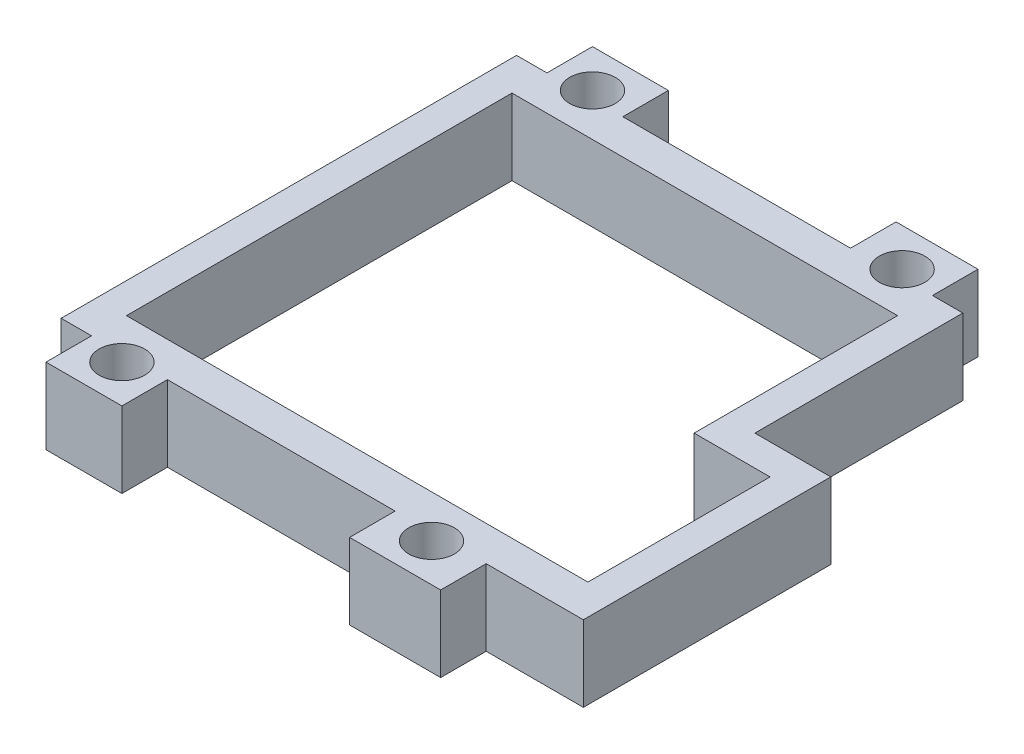
ISO-10303-21;
HEADER;
FILE_DESCRIPTION(('STEP AP214'),'2;1');
FILE_NAME('part.step','',(''),(''),'','','');
FILE_SCHEMA(('AUTOMOTIVE_DESIGN { 1 0 10303 214 1 1 1 1 }'));
ENDSEC;
DATA;
#1=APPLICATION_CONTEXT('core data for automotive mechanical design processes');
#2=APPLICATION_PROTOCOL_DEFINITION('international standard','automotive_design',2000,#1);
#3=PRODUCT_CONTEXT('',#1,'mechanical');
#4=PRODUCT('Part','Part','',(#3));
#5=PRODUCT_RELATED_PRODUCT_CATEGORY('part','',(#4));
#6=PRODUCT_DEFINITION_FORMATION('','',#4);
#7=PRODUCT_DEFINITION_CONTEXT('part definition',#1,'design');
#8=PRODUCT_DEFINITION('design','',#6,#7);
#9=PRODUCT_DEFINITION_SHAPE('','',#8);
#10=(LENGTH_UNIT() NAMED_UNIT(*) SI_UNIT(.MILLI.,.METRE.));
#11=(NAMED_UNIT(*) PLANE_ANGLE_UNIT() SI_UNIT($,.RADIAN.));
#12=(NAMED_UNIT(*) SI_UNIT($,.STERADIAN.) SOLID_ANGLE_UNIT());
#13=UNCERTAINTY_MEASURE_WITH_UNIT(LENGTH_MEASURE(1.E-05),#10,'distance_accuracy_value','');
#14=(GEOMETRIC_REPRESENTATION_CONTEXT(3) GLOBAL_UNCERTAINTY_ASSIGNED_CONTEXT((#13)) GLOBAL_UNIT_ASSIGNED_CONTEXT((#10,
#11,#12)) REPRESENTATION_CONTEXT('',''));
#15=CARTESIAN_POINT('',(0.,0.,0.));
#16=DIRECTION('',(0.,0.,1.));
#17=DIRECTION('',(1.,0.,0.));
#18=AXIS2_PLACEMENT_3D('',#15,#16,#17);
#19=CARTESIAN_POINT('',(-17.2,5.,-18.));
#20=DIRECTION('',(0.,0.,1.));
#21=DIRECTION('',(1.,0.,0.));
#22=AXIS2_PLACEMENT_3D('',#19,#20,#21);
#23=PLANE('',#22);
#24=DIRECTION('',(-1.,0.,0.));
#25=VECTOR('',#24,1.);
#26=CARTESIAN_POINT('',(-17.2,5.,-18.));
#27=LINE('',#26,#25);
#28=CARTESIAN_POINT('',(-10.2,5.,-18.));
#29=VERTEX_POINT('',#28);
#30=CARTESIAN_POINT('',(-15.2,5.,-18.));
#31=VERTEX_POINT('',#30);
#32=EDGE_CURVE('E260',#29,#31,#27,.T.);
#33=ORIENTED_EDGE('',*,*,#32,.F.);
#34=DIRECTION('',(0.,1.,0.));
#35=VECTOR('',#34,1.);
#36=CARTESIAN_POINT('',(-10.2,0.,-18.));
#37=LINE('',#36,#35);
#38=CARTESIAN_POINT('',(-10.2,0.,-18.));
#39=VERTEX_POINT('',#38);
#40=EDGE_CURVE('E412',#39,#29,#37,.T.);
#41=ORIENTED_EDGE('',*,*,#40,.F.);
#42=DIRECTION('',(-1.,0.,0.));
#43=VECTOR('',#42,1.);
#44=CARTESIAN_POINT('',(-17.2,0.,-18.));
#45=LINE('',#44,#43);
#46=CARTESIAN_POINT('',(-15.2,0.,-18.));
#47=VERTEX_POINT('',#46);
#48=EDGE_CURVE('E249',#39,#47,#45,.T.);
#49=ORIENTED_EDGE('',*,*,#48,.T.);
#50=DIRECTION('',(0.,1.,0.));
#51=VECTOR('',#50,1.);
#52=CARTESIAN_POINT('',(-15.2,0.,-18.));
#53=LINE('',#52,#51);
#54=EDGE_CURVE('E393',#47,#31,#53,.T.);
#55=ORIENTED_EDGE('',*,*,#54,.T.);
#56=EDGE_LOOP('',(#33,#41,#49,#55));
#57=FACE_BOUND('',#56,.T.);
#58=ADVANCED_FACE('F37',(#57),#23,.F.);
#59=CARTESIAN_POINT('',(-17.2,5.,18.));
#60=DIRECTION('',(0.,0.,-1.));
#61=DIRECTION('',(-1.,0.,0.));
#62=AXIS2_PLACEMENT_3D('',#59,#60,#61);
#63=PLANE('',#62);
#64=DIRECTION('',(1.,0.,0.));
#65=VECTOR('',#64,1.);
#66=CARTESIAN_POINT('',(-17.2,5.,18.));
#67=LINE('',#66,#65);
#68=CARTESIAN_POINT('',(-15.2,5.,18.));
#69=VERTEX_POINT('',#68);
#70=CARTESIAN_POINT('',(-10.2,5.,18.));
#71=VERTEX_POINT('',#70);
#72=EDGE_CURVE('E11',#69,#71,#67,.T.);
#73=ORIENTED_EDGE('',*,*,#72,.F.);
#74=DIRECTION('',(0.,1.,0.));
#75=VECTOR('',#74,1.);
#76=CARTESIAN_POINT('',(-15.2,0.,18.));
#77=LINE('',#76,#75);
#78=CARTESIAN_POINT('',(-15.2,0.,18.));
#79=VERTEX_POINT('',#78);
#80=EDGE_CURVE('E379',#79,#69,#77,.T.);
#81=ORIENTED_EDGE('',*,*,#80,.F.);
#82=DIRECTION('',(1.,0.,0.));
#83=VECTOR('',#82,1.);
#84=CARTESIAN_POINT('',(-17.2,0.,18.));
#85=LINE('',#84,#83);
#86=CARTESIAN_POINT('',(-10.2,0.,18.));
#87=VERTEX_POINT('',#86);
#88=EDGE_CURVE('E41',#79,#87,#85,.T.);
#89=ORIENTED_EDGE('',*,*,#88,.T.);
#90=DIRECTION('',(0.,1.,0.));
#91=VECTOR('',#90,1.);
#92=CARTESIAN_POINT('',(-10.2,0.,18.));
#93=LINE('',#92,#91);
#94=EDGE_CURVE('E334',#87,#71,#93,.T.);
#95=ORIENTED_EDGE('',*,*,#94,.T.);
#96=EDGE_LOOP('',(#73,#81,#89,#95));
#97=FACE_BOUND('',#96,.T.);
#98=ADVANCED_FACE('F496',(#97),#63,.F.);
#99=CARTESIAN_POINT('',(17.2,5.,18.));
#100=DIRECTION('',(-1.,0.,0.));
#101=DIRECTION('',(0.,0.,1.));
#102=AXIS2_PLACEMENT_3D('',#99,#100,#101);
#103=PLANE('',#102);
#104=DIRECTION('',(0.,0.,-1.));
#105=VECTOR('',#104,1.);
#106=CARTESIAN_POINT('',(17.2,0.,18.));
#107=LINE('',#106,#105);
#108=CARTESIAN_POINT('',(17.2,0.,15.));
#109=VERTEX_POINT('',#108);
#110=CARTESIAN_POINT('',(17.2,0.,-1.3));
#111=VERTEX_POINT('',#110);
#112=EDGE_CURVE('E252',#109,#111,#107,.T.);
#113=ORIENTED_EDGE('',*,*,#112,.T.);
#114=DIRECTION('',(0.,1.,0.));
#115=VECTOR('',#114,1.);
#116=CARTESIAN_POINT('',(17.2,0.,-1.3));
#117=LINE('',#116,#115);
#118=CARTESIAN_POINT('',(17.2,5.,-1.3));
#119=VERTEX_POINT('',#118);
#120=EDGE_CURVE('E434',#111,#119,#117,.T.);
#121=ORIENTED_EDGE('',*,*,#120,.T.);
#122=DIRECTION('',(0.,0.,-1.));
#123=VECTOR('',#122,1.);
#124=CARTESIAN_POINT('',(17.2,5.,18.));
#125=LINE('',#124,#123);
#126=CARTESIAN_POINT('',(17.2,5.,15.));
#127=VERTEX_POINT('',#126);
#128=EDGE_CURVE('E261',#127,#119,#125,.T.);
#129=ORIENTED_EDGE('',*,*,#128,.F.);
#130=DIRECTION('',(0.,1.,0.));
#131=VECTOR('',#130,1.);
#132=CARTESIAN_POINT('',(17.2,0.,15.));
#133=LINE('',#132,#131);
#134=EDGE_CURVE('E361',#109,#127,#133,.T.);
#135=ORIENTED_EDGE('',*,*,#134,.F.);
#136=EDGE_LOOP('',(#113,#121,#129,#135));
#137=FACE_BOUND('',#136,.T.);
#138=ADVANCED_FACE('F39',(#137),#103,.F.);
#139=CARTESIAN_POINT('',(10.2,5.,-18.));
#140=VERTEX_POINT('',#139);
#141=CARTESIAN_POINT('',(4.8,5.,-18.));
#142=VERTEX_POINT('',#141);
#143=EDGE_CURVE('E241',#140,#142,#27,.T.);
#144=ORIENTED_EDGE('',*,*,#143,.F.);
#145=DIRECTION('',(0.,1.,0.));
#146=VECTOR('',#145,1.);
#147=CARTESIAN_POINT('',(10.2,0.,-18.));
#148=LINE('',#147,#146);
#149=CARTESIAN_POINT('',(10.2,0.,-18.));
#150=VERTEX_POINT('',#149);
#151=EDGE_CURVE('E228',#150,#140,#148,.T.);
#152=ORIENTED_EDGE('',*,*,#151,.F.);
#153=CARTESIAN_POINT('',(4.8,0.,-18.));
#154=VERTEX_POINT('',#153);
#155=EDGE_CURVE('E239',#150,#154,#45,.T.);
#156=ORIENTED_EDGE('',*,*,#155,.T.);
#157=DIRECTION('',(0.,1.,0.));
#158=VECTOR('',#157,1.);
#159=CARTESIAN_POINT('',(4.8,0.,-18.));
#160=LINE('',#159,#158);
#161=EDGE_CURVE('E421',#154,#142,#160,.T.);
#162=ORIENTED_EDGE('',*,*,#161,.T.);
#163=EDGE_LOOP('',(#144,#152,#156,#162));
#164=FACE_BOUND('',#163,.T.);
#165=ADVANCED_FACE('F237',(#164),#23,.F.);
#166=CARTESIAN_POINT('',(-17.2,5.,18.));
#167=DIRECTION('',(1.,0.,0.));
#168=DIRECTION('',(0.,0.,-1.));
#169=AXIS2_PLACEMENT_3D('',#166,#167,#168);
#170=PLANE('',#169);
#171=DIRECTION('',(0.,0.,1.));
#172=VECTOR('',#171,1.);
#173=CARTESIAN_POINT('',(-17.2,5.,18.));
#174=LINE('',#173,#172);
#175=CARTESIAN_POINT('',(-17.2,5.,-15.));
#176=VERTEX_POINT('',#175);
#177=CARTESIAN_POINT('',(-17.2,5.,15.));
#178=VERTEX_POINT('',#177);
#179=EDGE_CURVE('E257',#176,#178,#174,.T.);
#180=ORIENTED_EDGE('',*,*,#179,.F.);
#181=DIRECTION('',(0.,1.,0.));
#182=VECTOR('',#181,1.);
#183=CARTESIAN_POINT('',(-17.2,0.,-15.));
#184=LINE('',#183,#182);
#185=CARTESIAN_POINT('',(-17.2,0.,-15.));
#186=VERTEX_POINT('',#185);
#187=EDGE_CURVE('E398',#186,#176,#184,.T.);
#188=ORIENTED_EDGE('',*,*,#187,.F.);
#189=DIRECTION('',(0.,0.,1.));
#190=VECTOR('',#189,1.);
#191=CARTESIAN_POINT('',(-17.2,0.,18.));
#192=LINE('',#191,#190);
#193=CARTESIAN_POINT('',(-17.2,0.,15.));
#194=VERTEX_POINT('',#193);
#195=EDGE_CURVE('E248',#186,#194,#192,.T.);
#196=ORIENTED_EDGE('',*,*,#195,.T.);
#197=DIRECTION('',(0.,1.,0.));
#198=VECTOR('',#197,1.);
#199=CARTESIAN_POINT('',(-17.2,0.,15.));
#200=LINE('',#199,#198);
#201=EDGE_CURVE('E374',#194,#178,#200,.T.);
#202=ORIENTED_EDGE('',*,*,#201,.T.);
#203=EDGE_LOOP('',(#180,#188,#196,#202));
#204=FACE_BOUND('',#203,.T.);
#205=ADVANCED_FACE('F513',(#204),#170,.F.);
#206=CARTESIAN_POINT('',(4.8,0.,18.));
#207=VERTEX_POINT('',#206);
#208=CARTESIAN_POINT('',(10.8,0.,18.));
#209=VERTEX_POINT('',#208);
#210=EDGE_CURVE('E251',#207,#209,#85,.T.);
#211=ORIENTED_EDGE('',*,*,#210,.T.);
#212=DIRECTION('',(0.,1.,0.));
#213=VECTOR('',#212,1.);
#214=CARTESIAN_POINT('',(10.8,0.,18.));
#215=LINE('',#214,#213);
#216=CARTESIAN_POINT('',(10.8,5.,18.));
#217=VERTEX_POINT('',#216);
#218=EDGE_CURVE('E353',#209,#217,#215,.T.);
#219=ORIENTED_EDGE('',*,*,#218,.T.);
#220=CARTESIAN_POINT('',(4.8,5.,18.));
#221=VERTEX_POINT('',#220);
#222=EDGE_CURVE('E46',#221,#217,#67,.T.);
#223=ORIENTED_EDGE('',*,*,#222,.F.);
#224=DIRECTION('',(0.,1.,0.));
#225=VECTOR('',#224,1.);
#226=CARTESIAN_POINT('',(4.8,0.,18.));
#227=LINE('',#226,#225);
#228=EDGE_CURVE('E337',#207,#221,#227,.T.);
#229=ORIENTED_EDGE('',*,*,#228,.F.);
#230=EDGE_LOOP('',(#211,#219,#223,#229));
#231=FACE_BOUND('',#230,.T.);
#232=ADVANCED_FACE('F483',(#231),#63,.F.);
#233=CARTESIAN_POINT('',(0.,5.,0.));
#234=DIRECTION('',(0.,-1.,0.));
#235=DIRECTION('',(0.,0.,-1.));
#236=AXIS2_PLACEMENT_3D('',#233,#234,#235);
#237=PLANE('',#236);
#238=CARTESIAN_POINT('',(-12.7,5.,15.5));
#239=DIRECTION('',(0.,1.,0.));
#240=DIRECTION('',(0.,0.,1.));
#241=AXIS2_PLACEMENT_3D('',#238,#239,#240);
#242=CIRCLE('',#241,1.5);
#243=CARTESIAN_POINT('',(-12.7,5.,17.));
#244=VERTEX_POINT('',#243);
#245=EDGE_CURVE('E309',#244,#244,#242,.T.);
#246=ORIENTED_EDGE('',*,*,#245,.F.);
#247=EDGE_LOOP('',(#246));
#248=FACE_BOUND('',#247,.T.);
#249=CARTESIAN_POINT('',(7.7,5.,15.5));
#250=DIRECTION('',(0.,1.,0.));
#251=DIRECTION('',(0.,0.,1.));
#252=AXIS2_PLACEMENT_3D('',#249,#250,#251);
#253=CIRCLE('',#252,1.5);
#254=CARTESIAN_POINT('',(7.7,5.,17.));
#255=VERTEX_POINT('',#254);
#256=EDGE_CURVE('E303',#255,#255,#253,.T.);
#257=ORIENTED_EDGE('',*,*,#256,.F.);
#258=EDGE_LOOP('',(#257));
#259=FACE_BOUND('',#258,.T.);
#260=CARTESIAN_POINT('',(7.7,5.,-15.5));
#261=DIRECTION('',(0.,1.,0.));
#262=DIRECTION('',(0.,0.,1.));
#263=AXIS2_PLACEMENT_3D('',#260,#261,#262);
#264=CIRCLE('',#263,1.5);
#265=CARTESIAN_POINT('',(7.7,5.,-14.));
#266=VERTEX_POINT('',#265);
#267=EDGE_CURVE('E297',#266,#266,#264,.T.);
#268=ORIENTED_EDGE('',*,*,#267,.F.);
#269=EDGE_LOOP('',(#268));
#270=FACE_BOUND('',#269,.T.);
#271=DIRECTION('',(0.,0.,-1.));
#272=VECTOR('',#271,1.);
#273=CARTESIAN_POINT('',(10.2,5.,-12.7));
#274=LINE('',#273,#272);
#275=CARTESIAN_POINT('',(10.2,5.,0.700000000000003));
#276=VERTEX_POINT('',#275);
#277=CARTESIAN_POINT('',(10.2,5.,-12.7));
#278=VERTEX_POINT('',#277);
#279=EDGE_CURVE('E282',#276,#278,#274,.T.);
#280=ORIENTED_EDGE('',*,*,#279,.F.);
#281=DIRECTION('',(-1.,0.,0.));
#282=VECTOR('',#281,1.);
#283=CARTESIAN_POINT('',(10.2,5.,0.700000000000003));
#284=LINE('',#283,#282);
#285=CARTESIAN_POINT('',(15.2,5.,0.700000000000003));
#286=VERTEX_POINT('',#285);
#287=EDGE_CURVE('E323',#286,#276,#284,.T.);
#288=ORIENTED_EDGE('',*,*,#287,.F.);
#289=DIRECTION('',(0.,0.,-1.));
#290=VECTOR('',#289,1.);
#291=CARTESIAN_POINT('',(15.2,5.,12.7));
#292=LINE('',#291,#290);
#293=CARTESIAN_POINT('',(15.2,5.,12.7));
#294=VERTEX_POINT('',#293);
#295=EDGE_CURVE('E326',#294,#286,#292,.T.);
#296=ORIENTED_EDGE('',*,*,#295,.F.);
#297=DIRECTION('',(1.,0.,0.));
#298=VECTOR('',#297,1.);
#299=CARTESIAN_POINT('',(-15.2,5.,12.7));
#300=LINE('',#299,#298);
#301=CARTESIAN_POINT('',(-15.2,5.,12.7));
#302=VERTEX_POINT('',#301);
#303=EDGE_CURVE('E284',#302,#294,#300,.T.);
#304=ORIENTED_EDGE('',*,*,#303,.F.);
#305=DIRECTION('',(0.,0.,1.));
#306=VECTOR('',#305,1.);
#307=CARTESIAN_POINT('',(-15.2,5.,-12.7));
#308=LINE('',#307,#306);
#309=CARTESIAN_POINT('',(-15.2,5.,-12.7));
#310=VERTEX_POINT('',#309);
#311=EDGE_CURVE('E286',#310,#302,#308,.T.);
#312=ORIENTED_EDGE('',*,*,#311,.F.);
#313=DIRECTION('',(-1.,0.,0.));
#314=VECTOR('',#313,1.);
#315=CARTESIAN_POINT('',(-15.2,5.,-12.7));
#316=LINE('',#315,#314);
#317=EDGE_CURVE('E278',#278,#310,#316,.T.);
#318=ORIENTED_EDGE('',*,*,#317,.F.);
#319=EDGE_LOOP('',(#280,#288,#296,#304,#312,#318));
#320=FACE_BOUND('',#319,.T.);
#321=CARTESIAN_POINT('',(-12.7,5.,-15.5));
#322=DIRECTION('',(0.,1.,0.));
#323=DIRECTION('',(0.,0.,1.));
#324=AXIS2_PLACEMENT_3D('',#321,#322,#323);
#325=CIRCLE('',#324,1.5);
#326=CARTESIAN_POINT('',(-12.7,5.,-14.));
#327=VERTEX_POINT('',#326);
#328=EDGE_CURVE('E264',#327,#327,#325,.T.);
#329=ORIENTED_EDGE('',*,*,#328,.F.);
#330=EDGE_LOOP('',(#329));
#331=FACE_BOUND('',#330,.T.);
#332=DIRECTION('',(0.,0.,1.));
#333=VECTOR('',#332,1.);
#334=CARTESIAN_POINT('',(12.2,5.,-18.));
#335=LINE('',#334,#333);
#336=CARTESIAN_POINT('',(12.2,5.,-15.));
#337=VERTEX_POINT('',#336);
#338=CARTESIAN_POINT('',(12.2,5.,-1.3));
#339=VERTEX_POINT('',#338);
#340=EDGE_CURVE('E448',#337,#339,#335,.T.);
#341=ORIENTED_EDGE('',*,*,#340,.F.);
#342=DIRECTION('',(1.,0.,0.));
#343=VECTOR('',#342,1.);
#344=CARTESIAN_POINT('',(12.2,5.,-15.));
#345=LINE('',#344,#343);
#346=CARTESIAN_POINT('',(10.2,5.,-15.));
#347=VERTEX_POINT('',#346);
#348=EDGE_CURVE('E54',#347,#337,#345,.T.);
#349=ORIENTED_EDGE('',*,*,#348,.F.);
#350=DIRECTION('',(0.,0.,1.));
#351=VECTOR('',#350,1.);
#352=CARTESIAN_POINT('',(10.2,5.,-18.));
#353=LINE('',#352,#351);
#354=EDGE_CURVE('E456',#140,#347,#353,.T.);
#355=ORIENTED_EDGE('',*,*,#354,.F.);
#356=ORIENTED_EDGE('',*,*,#143,.T.);
#357=DIRECTION('',(0.,0.,-1.));
#358=VECTOR('',#357,1.);
#359=CARTESIAN_POINT('',(4.8,5.,-18.));
#360=LINE('',#359,#358);
#361=CARTESIAN_POINT('',(4.8,5.,-15.));
#362=VERTEX_POINT('',#361);
#363=EDGE_CURVE('E424',#362,#142,#360,.T.);
#364=ORIENTED_EDGE('',*,*,#363,.F.);
#365=DIRECTION('',(1.,0.,0.));
#366=VECTOR('',#365,1.);
#367=CARTESIAN_POINT('',(-10.2,5.,-15.));
#368=LINE('',#367,#366);
#369=CARTESIAN_POINT('',(-10.2,5.,-15.));
#370=VERTEX_POINT('',#369);
#371=EDGE_CURVE('E428',#370,#362,#368,.T.);
#372=ORIENTED_EDGE('',*,*,#371,.F.);
#373=DIRECTION('',(0.,0.,1.));
#374=VECTOR('',#373,1.);
#375=CARTESIAN_POINT('',(-10.2,5.,-18.));
#376=LINE('',#375,#374);
#377=EDGE_CURVE('E431',#29,#370,#376,.T.);
#378=ORIENTED_EDGE('',*,*,#377,.F.);
#379=ORIENTED_EDGE('',*,*,#32,.T.);
#380=DIRECTION('',(0.,0.,-1.));
#381=VECTOR('',#380,1.);
#382=CARTESIAN_POINT('',(-15.2,5.,-18.));
#383=LINE('',#382,#381);
#384=CARTESIAN_POINT('',(-15.2,5.,-15.));
#385=VERTEX_POINT('',#384);
#386=EDGE_CURVE('E405',#385,#31,#383,.T.);
#387=ORIENTED_EDGE('',*,*,#386,.F.);
#388=DIRECTION('',(1.,0.,0.));
#389=VECTOR('',#388,1.);
#390=CARTESIAN_POINT('',(-17.2,5.,-15.));
#391=LINE('',#390,#389);
#392=EDGE_CURVE('E409',#176,#385,#391,.T.);
#393=ORIENTED_EDGE('',*,*,#392,.F.);
#394=ORIENTED_EDGE('',*,*,#179,.T.);
#395=DIRECTION('',(-1.,0.,0.));
#396=VECTOR('',#395,1.);
#397=CARTESIAN_POINT('',(-17.2,5.,15.));
#398=LINE('',#397,#396);
#399=CARTESIAN_POINT('',(-15.2,5.,15.));
#400=VERTEX_POINT('',#399);
#401=EDGE_CURVE('E386',#400,#178,#398,.T.);
#402=ORIENTED_EDGE('',*,*,#401,.F.);
#403=DIRECTION('',(0.,0.,-1.));
#404=VECTOR('',#403,1.);
#405=CARTESIAN_POINT('',(-15.2,5.,18.));
#406=LINE('',#405,#404);
#407=EDGE_CURVE('E390',#69,#400,#406,.T.);
#408=ORIENTED_EDGE('',*,*,#407,.F.);
#409=ORIENTED_EDGE('',*,*,#72,.T.);
#410=DIRECTION('',(0.,0.,1.));
#411=VECTOR('',#410,1.);
#412=CARTESIAN_POINT('',(-10.2,5.,18.));
#413=LINE('',#412,#411);
#414=CARTESIAN_POINT('',(-10.2,5.,15.));
#415=VERTEX_POINT('',#414);
#416=EDGE_CURVE('E350',#415,#71,#413,.T.);
#417=ORIENTED_EDGE('',*,*,#416,.F.);
#418=DIRECTION('',(-1.,0.,0.));
#419=VECTOR('',#418,1.);
#420=CARTESIAN_POINT('',(-10.2,5.,15.));
#421=LINE('',#420,#419);
#422=CARTESIAN_POINT('',(4.8,5.,15.));
#423=VERTEX_POINT('',#422);
#424=EDGE_CURVE('E343',#423,#415,#421,.T.);
#425=ORIENTED_EDGE('',*,*,#424,.F.);
#426=DIRECTION('',(0.,0.,-1.));
#427=VECTOR('',#426,1.);
#428=CARTESIAN_POINT('',(4.8,5.,18.));
#429=LINE('',#428,#427);
#430=EDGE_CURVE('E347',#221,#423,#429,.T.);
#431=ORIENTED_EDGE('',*,*,#430,.F.);
#432=ORIENTED_EDGE('',*,*,#222,.T.);
#433=DIRECTION('',(0.,0.,1.));
#434=VECTOR('',#433,1.);
#435=CARTESIAN_POINT('',(10.8,5.,18.));
#436=LINE('',#435,#434);
#437=CARTESIAN_POINT('',(10.8,5.,15.));
#438=VERTEX_POINT('',#437);
#439=EDGE_CURVE('E368',#438,#217,#436,.T.);
#440=ORIENTED_EDGE('',*,*,#439,.F.);
#441=DIRECTION('',(-1.,0.,0.));
#442=VECTOR('',#441,1.);
#443=CARTESIAN_POINT('',(17.2,5.,15.));
#444=LINE('',#443,#442);
#445=EDGE_CURVE('E371',#127,#438,#444,.T.);
#446=ORIENTED_EDGE('',*,*,#445,.F.);
#447=ORIENTED_EDGE('',*,*,#128,.T.);
#448=DIRECTION('',(1.,0.,0.));
#449=VECTOR('',#448,1.);
#450=CARTESIAN_POINT('',(17.2,5.,-1.3));
#451=LINE('',#450,#449);
#452=EDGE_CURVE('E446',#339,#119,#451,.T.);
#453=ORIENTED_EDGE('',*,*,#452,.F.);
#454=EDGE_LOOP('',(#341,#349,#355,#356,#364,#372,#378,#379,#387,#393,#394,#402,#408,#409,#417,
#425,#431,#432,#440,#446,#447,#453));
#455=FACE_BOUND('',#454,.T.);
#456=ADVANCED_FACE('F466',(#248,#259,#270,#320,#331,#455),#237,.F.);
#457=CARTESIAN_POINT('',(0.,0.,0.));
#458=DIRECTION('',(0.,-1.,0.));
#459=DIRECTION('',(0.,0.,-1.));
#460=AXIS2_PLACEMENT_3D('',#457,#458,#459);
#461=PLANE('',#460);
#462=DIRECTION('',(1.,0.,0.));
#463=VECTOR('',#462,1.);
#464=CARTESIAN_POINT('',(12.2,0.,-15.));
#465=LINE('',#464,#463);
#466=CARTESIAN_POINT('',(10.2,0.,-15.));
#467=VERTEX_POINT('',#466);
#468=CARTESIAN_POINT('',(12.2,0.,-15.));
#469=VERTEX_POINT('',#468);
#470=EDGE_CURVE('E233',#467,#469,#465,.T.);
#471=ORIENTED_EDGE('',*,*,#470,.T.);
#472=DIRECTION('',(0.,0.,1.));
#473=VECTOR('',#472,1.);
#474=CARTESIAN_POINT('',(12.2,0.,-18.));
#475=LINE('',#474,#473);
#476=CARTESIAN_POINT('',(12.2,0.,-1.3));
#477=VERTEX_POINT('',#476);
#478=EDGE_CURVE('E62',#469,#477,#475,.T.);
#479=ORIENTED_EDGE('',*,*,#478,.T.);
#480=DIRECTION('',(1.,0.,0.));
#481=VECTOR('',#480,1.);
#482=CARTESIAN_POINT('',(17.2,0.,-1.3));
#483=LINE('',#482,#481);
#484=EDGE_CURVE('E443',#477,#111,#483,.T.);
#485=ORIENTED_EDGE('',*,*,#484,.T.);
#486=ORIENTED_EDGE('',*,*,#112,.F.);
#487=DIRECTION('',(-1.,0.,0.));
#488=VECTOR('',#487,1.);
#489=CARTESIAN_POINT('',(17.2,0.,15.));
#490=LINE('',#489,#488);
#491=CARTESIAN_POINT('',(10.8,0.,15.));
#492=VERTEX_POINT('',#491);
#493=EDGE_CURVE('E370',#109,#492,#490,.T.);
#494=ORIENTED_EDGE('',*,*,#493,.T.);
#495=DIRECTION('',(0.,0.,1.));
#496=VECTOR('',#495,1.);
#497=CARTESIAN_POINT('',(10.8,0.,18.));
#498=LINE('',#497,#496);
#499=EDGE_CURVE('E364',#492,#209,#498,.T.);
#500=ORIENTED_EDGE('',*,*,#499,.T.);
#501=ORIENTED_EDGE('',*,*,#210,.F.);
#502=DIRECTION('',(0.,0.,-1.));
#503=VECTOR('',#502,1.);
#504=CARTESIAN_POINT('',(4.8,0.,18.));
#505=LINE('',#504,#503);
#506=CARTESIAN_POINT('',(4.8,0.,15.));
#507=VERTEX_POINT('',#506);
#508=EDGE_CURVE('E356',#207,#507,#505,.T.);
#509=ORIENTED_EDGE('',*,*,#508,.T.);
#510=DIRECTION('',(-1.,0.,0.));
#511=VECTOR('',#510,1.);
#512=CARTESIAN_POINT('',(-10.2,0.,15.));
#513=LINE('',#512,#511);
#514=CARTESIAN_POINT('',(-10.2,0.,15.));
#515=VERTEX_POINT('',#514);
#516=EDGE_CURVE('E338',#507,#515,#513,.T.);
#517=ORIENTED_EDGE('',*,*,#516,.T.);
#518=DIRECTION('',(0.,0.,1.));
#519=VECTOR('',#518,1.);
#520=CARTESIAN_POINT('',(-10.2,0.,18.));
#521=LINE('',#520,#519);
#522=EDGE_CURVE('E346',#515,#87,#521,.T.);
#523=ORIENTED_EDGE('',*,*,#522,.T.);
#524=ORIENTED_EDGE('',*,*,#88,.F.);
#525=DIRECTION('',(0.,0.,-1.));
#526=VECTOR('',#525,1.);
#527=CARTESIAN_POINT('',(-15.2,0.,18.));
#528=LINE('',#527,#526);
#529=CARTESIAN_POINT('',(-15.2,0.,15.));
#530=VERTEX_POINT('',#529);
#531=EDGE_CURVE('E389',#79,#530,#528,.T.);
#532=ORIENTED_EDGE('',*,*,#531,.T.);
#533=DIRECTION('',(-1.,0.,0.));
#534=VECTOR('',#533,1.);
#535=CARTESIAN_POINT('',(-17.2,0.,15.));
#536=LINE('',#535,#534);
#537=EDGE_CURVE('E382',#530,#194,#536,.T.);
#538=ORIENTED_EDGE('',*,*,#537,.T.);
#539=ORIENTED_EDGE('',*,*,#195,.F.);
#540=DIRECTION('',(1.,0.,0.));
#541=VECTOR('',#540,1.);
#542=CARTESIAN_POINT('',(-17.2,0.,-15.));
#543=LINE('',#542,#541);
#544=CARTESIAN_POINT('',(-15.2,0.,-15.));
#545=VERTEX_POINT('',#544);
#546=EDGE_CURVE('E408',#186,#545,#543,.T.);
#547=ORIENTED_EDGE('',*,*,#546,.T.);
#548=DIRECTION('',(0.,0.,-1.));
#549=VECTOR('',#548,1.);
#550=CARTESIAN_POINT('',(-15.2,0.,-18.));
#551=LINE('',#550,#549);
#552=EDGE_CURVE('E401',#545,#47,#551,.T.);
#553=ORIENTED_EDGE('',*,*,#552,.T.);
#554=ORIENTED_EDGE('',*,*,#48,.F.);
#555=DIRECTION('',(0.,0.,1.));
#556=VECTOR('',#555,1.);
#557=CARTESIAN_POINT('',(-10.2,0.,-18.));
#558=LINE('',#557,#556);
#559=CARTESIAN_POINT('',(-10.2,0.,-15.));
#560=VERTEX_POINT('',#559);
#561=EDGE_CURVE('E427',#39,#560,#558,.T.);
#562=ORIENTED_EDGE('',*,*,#561,.T.);
#563=DIRECTION('',(1.,0.,0.));
#564=VECTOR('',#563,1.);
#565=CARTESIAN_POINT('',(-10.2,0.,-15.));
#566=LINE('',#565,#564);
#567=CARTESIAN_POINT('',(4.8,0.,-15.));
#568=VERTEX_POINT('',#567);
#569=EDGE_CURVE('E436',#560,#568,#566,.T.);
#570=ORIENTED_EDGE('',*,*,#569,.T.);
#571=DIRECTION('',(0.,0.,-1.));
#572=VECTOR('',#571,1.);
#573=CARTESIAN_POINT('',(4.8,0.,-18.));
#574=LINE('',#573,#572);
#575=EDGE_CURVE('E247',#568,#154,#574,.T.);
#576=ORIENTED_EDGE('',*,*,#575,.T.);
#577=ORIENTED_EDGE('',*,*,#155,.F.);
#578=DIRECTION('',(0.,0.,1.));
#579=VECTOR('',#578,1.);
#580=CARTESIAN_POINT('',(10.2,0.,-18.));
#581=LINE('',#580,#579);
#582=EDGE_CURVE('E224',#150,#467,#581,.T.);
#583=ORIENTED_EDGE('',*,*,#582,.T.);
#584=EDGE_LOOP('',(#471,#479,#485,#486,#494,#500,#501,#509,#517,#523,#524,#532,#538,#539,#547,
#553,#554,#562,#570,#576,#577,#583));
#585=FACE_BOUND('',#584,.T.);
#586=DIRECTION('',(-1.,0.,0.));
#587=VECTOR('',#586,1.);
#588=CARTESIAN_POINT('',(10.2,0.,0.700000000000003));
#589=LINE('',#588,#587);
#590=CARTESIAN_POINT('',(15.2,0.,0.700000000000003));
#591=VERTEX_POINT('',#590);
#592=CARTESIAN_POINT('',(10.2,0.,0.700000000000003));
#593=VERTEX_POINT('',#592);
#594=EDGE_CURVE('E319',#591,#593,#589,.T.);
#595=ORIENTED_EDGE('',*,*,#594,.T.);
#596=DIRECTION('',(0.,0.,-1.));
#597=VECTOR('',#596,1.);
#598=CARTESIAN_POINT('',(10.2,0.,-12.7));
#599=LINE('',#598,#597);
#600=CARTESIAN_POINT('',(10.2,0.,-12.7));
#601=VERTEX_POINT('',#600);
#602=EDGE_CURVE('E291',#593,#601,#599,.T.);
#603=ORIENTED_EDGE('',*,*,#602,.T.);
#604=DIRECTION('',(-1.,0.,0.));
#605=VECTOR('',#604,1.);
#606=CARTESIAN_POINT('',(-15.2,0.,-12.7));
#607=LINE('',#606,#605);
#608=CARTESIAN_POINT('',(-15.2,0.,-12.7));
#609=VERTEX_POINT('',#608);
#610=EDGE_CURVE('E274',#601,#609,#607,.T.);
#611=ORIENTED_EDGE('',*,*,#610,.T.);
#612=DIRECTION('',(0.,0.,1.));
#613=VECTOR('',#612,1.);
#614=CARTESIAN_POINT('',(-15.2,0.,-12.7));
#615=LINE('',#614,#613);
#616=CARTESIAN_POINT('',(-15.2,0.,12.7));
#617=VERTEX_POINT('',#616);
#618=EDGE_CURVE('E281',#609,#617,#615,.T.);
#619=ORIENTED_EDGE('',*,*,#618,.T.);
#620=DIRECTION('',(1.,0.,0.));
#621=VECTOR('',#620,1.);
#622=CARTESIAN_POINT('',(-15.2,0.,12.7));
#623=LINE('',#622,#621);
#624=CARTESIAN_POINT('',(15.2,0.,12.7));
#625=VERTEX_POINT('',#624);
#626=EDGE_CURVE('E293',#617,#625,#623,.T.);
#627=ORIENTED_EDGE('',*,*,#626,.T.);
#628=DIRECTION('',(0.,0.,-1.));
#629=VECTOR('',#628,1.);
#630=CARTESIAN_POINT('',(15.2,0.,12.7));
#631=LINE('',#630,#629);
#632=EDGE_CURVE('E325',#625,#591,#631,.T.);
#633=ORIENTED_EDGE('',*,*,#632,.T.);
#634=EDGE_LOOP('',(#595,#603,#611,#619,#627,#633));
#635=FACE_BOUND('',#634,.T.);
#636=CARTESIAN_POINT('',(-12.7,0.,15.5));
#637=DIRECTION('',(0.,1.,0.));
#638=DIRECTION('',(0.,0.,1.));
#639=AXIS2_PLACEMENT_3D('',#636,#637,#638);
#640=CIRCLE('',#639,1.5);
#641=CARTESIAN_POINT('',(-12.7,0.,17.));
#642=VERTEX_POINT('',#641);
#643=EDGE_CURVE('E306',#642,#642,#640,.T.);
#644=ORIENTED_EDGE('',*,*,#643,.T.);
#645=EDGE_LOOP('',(#644));
#646=FACE_BOUND('',#645,.T.);
#647=CARTESIAN_POINT('',(7.7,0.,15.5));
#648=DIRECTION('',(0.,1.,0.));
#649=DIRECTION('',(0.,0.,1.));
#650=AXIS2_PLACEMENT_3D('',#647,#648,#649);
#651=CIRCLE('',#650,1.5);
#652=CARTESIAN_POINT('',(7.7,0.,17.));
#653=VERTEX_POINT('',#652);
#654=EDGE_CURVE('E300',#653,#653,#651,.T.);
#655=ORIENTED_EDGE('',*,*,#654,.T.);
#656=EDGE_LOOP('',(#655));
#657=FACE_BOUND('',#656,.T.);
#658=CARTESIAN_POINT('',(7.7,0.,-15.5));
#659=DIRECTION('',(0.,1.,0.));
#660=DIRECTION('',(0.,0.,1.));
#661=AXIS2_PLACEMENT_3D('',#658,#659,#660);
#662=CIRCLE('',#661,1.5);
#663=CARTESIAN_POINT('',(7.7,0.,-14.));
#664=VERTEX_POINT('',#663);
#665=EDGE_CURVE('E288',#664,#664,#662,.T.);
#666=ORIENTED_EDGE('',*,*,#665,.T.);
#667=EDGE_LOOP('',(#666));
#668=FACE_BOUND('',#667,.T.);
#669=CARTESIAN_POINT('',(-12.7,0.,-15.5));
#670=DIRECTION('',(0.,1.,0.));
#671=DIRECTION('',(0.,0.,1.));
#672=AXIS2_PLACEMENT_3D('',#669,#670,#671);
#673=CIRCLE('',#672,1.5);
#674=CARTESIAN_POINT('',(-12.7,0.,-14.));
#675=VERTEX_POINT('',#674);
#676=EDGE_CURVE('E255',#675,#675,#673,.T.);
#677=ORIENTED_EDGE('',*,*,#676,.T.);
#678=EDGE_LOOP('',(#677));
#679=FACE_BOUND('',#678,.T.);
#680=ADVANCED_FACE('F244',(#585,#635,#646,#657,#668,#679),#461,.T.);
#681=CARTESIAN_POINT('',(-12.7,0.,-15.5));
#682=DIRECTION('',(0.,1.,0.));
#683=DIRECTION('',(0.,0.,1.));
#684=AXIS2_PLACEMENT_3D('',#681,#682,#683);
#685=CYLINDRICAL_SURFACE('',#684,1.5);
#686=ORIENTED_EDGE('',*,*,#676,.F.);
#687=EDGE_LOOP('',(#686));
#688=FACE_BOUND('',#687,.T.);
#689=ORIENTED_EDGE('',*,*,#328,.T.);
#690=EDGE_LOOP('',(#689));
#691=FACE_BOUND('',#690,.T.);
#692=ADVANCED_FACE('F673',(#688,#691),#685,.F.);
#693=CARTESIAN_POINT('',(-15.2,0.,-12.7));
#694=DIRECTION('',(-1.,0.,0.));
#695=DIRECTION('',(0.,0.,1.));
#696=AXIS2_PLACEMENT_3D('',#693,#694,#695);
#697=PLANE('',#696);
#698=ORIENTED_EDGE('',*,*,#311,.T.);
#699=DIRECTION('',(0.,1.,0.));
#700=VECTOR('',#699,1.);
#701=CARTESIAN_POINT('',(-15.2,0.,12.7));
#702=LINE('',#701,#700);
#703=EDGE_CURVE('E270',#617,#302,#702,.T.);
#704=ORIENTED_EDGE('',*,*,#703,.F.);
#705=ORIENTED_EDGE('',*,*,#618,.F.);
#706=DIRECTION('',(0.,1.,0.));
#707=VECTOR('',#706,1.);
#708=CARTESIAN_POINT('',(-15.2,0.,-12.7));
#709=LINE('',#708,#707);
#710=EDGE_CURVE('E267',#609,#310,#709,.T.);
#711=ORIENTED_EDGE('',*,*,#710,.T.);
#712=EDGE_LOOP('',(#698,#704,#705,#711));
#713=FACE_BOUND('',#712,.T.);
#714=ADVANCED_FACE('F744',(#713),#697,.F.);
#715=CARTESIAN_POINT('',(-15.2,0.,-12.7));
#716=DIRECTION('',(0.,0.,-1.));
#717=DIRECTION('',(-1.,0.,0.));
#718=AXIS2_PLACEMENT_3D('',#715,#716,#717);
#719=PLANE('',#718);
#720=ORIENTED_EDGE('',*,*,#317,.T.);
#721=ORIENTED_EDGE('',*,*,#710,.F.);
#722=ORIENTED_EDGE('',*,*,#610,.F.);
#723=DIRECTION('',(0.,1.,0.));
#724=VECTOR('',#723,1.);
#725=CARTESIAN_POINT('',(10.2,0.,-12.7));
#726=LINE('',#725,#724);
#727=EDGE_CURVE('E273',#601,#278,#726,.T.);
#728=ORIENTED_EDGE('',*,*,#727,.T.);
#729=EDGE_LOOP('',(#720,#721,#722,#728));
#730=FACE_BOUND('',#729,.T.);
#731=ADVANCED_FACE('F740',(#730),#719,.F.);
#732=CARTESIAN_POINT('',(10.2,0.,-12.7));
#733=DIRECTION('',(1.,0.,0.));
#734=DIRECTION('',(0.,0.,-1.));
#735=AXIS2_PLACEMENT_3D('',#732,#733,#734);
#736=PLANE('',#735);
#737=ORIENTED_EDGE('',*,*,#602,.F.);
#738=DIRECTION('',(0.,1.,0.));
#739=VECTOR('',#738,1.);
#740=CARTESIAN_POINT('',(10.2,0.,0.700000000000003));
#741=LINE('',#740,#739);
#742=EDGE_CURVE('E312',#593,#276,#741,.T.);
#743=ORIENTED_EDGE('',*,*,#742,.T.);
#744=ORIENTED_EDGE('',*,*,#279,.T.);
#745=ORIENTED_EDGE('',*,*,#727,.F.);
#746=EDGE_LOOP('',(#737,#743,#744,#745));
#747=FACE_BOUND('',#746,.T.);
#748=ADVANCED_FACE('F743',(#747),#736,.F.);
#749=CARTESIAN_POINT('',(-15.2,0.,12.7));
#750=DIRECTION('',(0.,0.,1.));
#751=DIRECTION('',(1.,0.,0.));
#752=AXIS2_PLACEMENT_3D('',#749,#750,#751);
#753=PLANE('',#752);
#754=ORIENTED_EDGE('',*,*,#303,.T.);
#755=DIRECTION('',(0.,1.,0.));
#756=VECTOR('',#755,1.);
#757=CARTESIAN_POINT('',(15.2,0.,12.7));
#758=LINE('',#757,#756);
#759=EDGE_CURVE('E315',#625,#294,#758,.T.);
#760=ORIENTED_EDGE('',*,*,#759,.F.);
#761=ORIENTED_EDGE('',*,*,#626,.F.);
#762=ORIENTED_EDGE('',*,*,#703,.T.);
#763=EDGE_LOOP('',(#754,#760,#761,#762));
#764=FACE_BOUND('',#763,.T.);
#765=ADVANCED_FACE('F738',(#764),#753,.F.);
#766=CARTESIAN_POINT('',(7.7,0.,-15.5));
#767=DIRECTION('',(0.,1.,0.));
#768=DIRECTION('',(0.,0.,1.));
#769=AXIS2_PLACEMENT_3D('',#766,#767,#768);
#770=CYLINDRICAL_SURFACE('',#769,1.5);
#771=ORIENTED_EDGE('',*,*,#665,.F.);
#772=EDGE_LOOP('',(#771));
#773=FACE_BOUND('',#772,.T.);
#774=ORIENTED_EDGE('',*,*,#267,.T.);
#775=EDGE_LOOP('',(#774));
#776=FACE_BOUND('',#775,.T.);
#777=ADVANCED_FACE('F734',(#773,#776),#770,.F.);
#778=CARTESIAN_POINT('',(7.7,0.,15.5));
#779=DIRECTION('',(0.,1.,0.));
#780=DIRECTION('',(0.,0.,1.));
#781=AXIS2_PLACEMENT_3D('',#778,#779,#780);
#782=CYLINDRICAL_SURFACE('',#781,1.5);
#783=ORIENTED_EDGE('',*,*,#654,.F.);
#784=EDGE_LOOP('',(#783));
#785=FACE_BOUND('',#784,.T.);
#786=ORIENTED_EDGE('',*,*,#256,.T.);
#787=EDGE_LOOP('',(#786));
#788=FACE_BOUND('',#787,.T.);
#789=ADVANCED_FACE('F730',(#785,#788),#782,.F.);
#790=CARTESIAN_POINT('',(-12.7,0.,15.5));
#791=DIRECTION('',(0.,1.,0.));
#792=DIRECTION('',(0.,0.,1.));
#793=AXIS2_PLACEMENT_3D('',#790,#791,#792);
#794=CYLINDRICAL_SURFACE('',#793,1.5);
#795=ORIENTED_EDGE('',*,*,#643,.F.);
#796=EDGE_LOOP('',(#795));
#797=FACE_BOUND('',#796,.T.);
#798=ORIENTED_EDGE('',*,*,#245,.T.);
#799=EDGE_LOOP('',(#798));
#800=FACE_BOUND('',#799,.T.);
#801=ADVANCED_FACE('F723',(#797,#800),#794,.F.);
#802=CARTESIAN_POINT('',(10.2,0.,0.700000000000003));
#803=DIRECTION('',(0.,0.,-1.));
#804=DIRECTION('',(-1.,0.,0.));
#805=AXIS2_PLACEMENT_3D('',#802,#803,#804);
#806=PLANE('',#805);
#807=ORIENTED_EDGE('',*,*,#287,.T.);
#808=ORIENTED_EDGE('',*,*,#742,.F.);
#809=ORIENTED_EDGE('',*,*,#594,.F.);
#810=DIRECTION('',(0.,1.,0.));
#811=VECTOR('',#810,1.);
#812=CARTESIAN_POINT('',(15.2,0.,0.700000000000003));
#813=LINE('',#812,#811);
#814=EDGE_CURVE('E318',#591,#286,#813,.T.);
#815=ORIENTED_EDGE('',*,*,#814,.T.);
#816=EDGE_LOOP('',(#807,#808,#809,#815));
#817=FACE_BOUND('',#816,.T.);
#818=ADVANCED_FACE('F720',(#817),#806,.F.);
#819=CARTESIAN_POINT('',(15.2,0.,12.7));
#820=DIRECTION('',(1.,0.,0.));
#821=DIRECTION('',(0.,0.,-1.));
#822=AXIS2_PLACEMENT_3D('',#819,#820,#821);
#823=PLANE('',#822);
#824=ORIENTED_EDGE('',*,*,#295,.T.);
#825=ORIENTED_EDGE('',*,*,#814,.F.);
#826=ORIENTED_EDGE('',*,*,#632,.F.);
#827=ORIENTED_EDGE('',*,*,#759,.T.);
#828=EDGE_LOOP('',(#824,#825,#826,#827));
#829=FACE_BOUND('',#828,.T.);
#830=ADVANCED_FACE('F719',(#829),#823,.F.);
#831=CARTESIAN_POINT('',(-10.2,0.,18.));
#832=DIRECTION('',(-1.,0.,0.));
#833=DIRECTION('',(0.,0.,1.));
#834=AXIS2_PLACEMENT_3D('',#831,#832,#833);
#835=PLANE('',#834);
#836=ORIENTED_EDGE('',*,*,#416,.T.);
#837=ORIENTED_EDGE('',*,*,#94,.F.);
#838=ORIENTED_EDGE('',*,*,#522,.F.);
#839=DIRECTION('',(0.,1.,0.));
#840=VECTOR('',#839,1.);
#841=CARTESIAN_POINT('',(-10.2,0.,15.));
#842=LINE('',#841,#840);
#843=EDGE_CURVE('E329',#515,#415,#842,.T.);
#844=ORIENTED_EDGE('',*,*,#843,.T.);
#845=EDGE_LOOP('',(#836,#837,#838,#844));
#846=FACE_BOUND('',#845,.T.);
#847=ADVANCED_FACE('F499',(#846),#835,.F.);
#848=CARTESIAN_POINT('',(-10.2,0.,15.));
#849=DIRECTION('',(0.,0.,-1.));
#850=DIRECTION('',(-1.,0.,0.));
#851=AXIS2_PLACEMENT_3D('',#848,#849,#850);
#852=PLANE('',#851);
#853=ORIENTED_EDGE('',*,*,#424,.T.);
#854=ORIENTED_EDGE('',*,*,#843,.F.);
#855=ORIENTED_EDGE('',*,*,#516,.F.);
#856=DIRECTION('',(0.,1.,0.));
#857=VECTOR('',#856,1.);
#858=CARTESIAN_POINT('',(4.8,0.,15.));
#859=LINE('',#858,#857);
#860=EDGE_CURVE('E340',#507,#423,#859,.T.);
#861=ORIENTED_EDGE('',*,*,#860,.T.);
#862=EDGE_LOOP('',(#853,#854,#855,#861));
#863=FACE_BOUND('',#862,.T.);
#864=ADVANCED_FACE('F501',(#863),#852,.F.);
#865=CARTESIAN_POINT('',(4.8,0.,18.));
#866=DIRECTION('',(1.,0.,0.));
#867=DIRECTION('',(0.,0.,-1.));
#868=AXIS2_PLACEMENT_3D('',#865,#866,#867);
#869=PLANE('',#868);
#870=ORIENTED_EDGE('',*,*,#430,.T.);
#871=ORIENTED_EDGE('',*,*,#860,.F.);
#872=ORIENTED_EDGE('',*,*,#508,.F.);
#873=ORIENTED_EDGE('',*,*,#228,.T.);
#874=EDGE_LOOP('',(#870,#871,#872,#873));
#875=FACE_BOUND('',#874,.T.);
#876=ADVANCED_FACE('F490',(#875),#869,.F.);
#877=CARTESIAN_POINT('',(10.8,0.,18.));
#878=DIRECTION('',(-1.,0.,0.));
#879=DIRECTION('',(0.,0.,1.));
#880=AXIS2_PLACEMENT_3D('',#877,#878,#879);
#881=PLANE('',#880);
#882=ORIENTED_EDGE('',*,*,#439,.T.);
#883=ORIENTED_EDGE('',*,*,#218,.F.);
#884=ORIENTED_EDGE('',*,*,#499,.F.);
#885=DIRECTION('',(0.,1.,0.));
#886=VECTOR('',#885,1.);
#887=CARTESIAN_POINT('',(10.8,0.,15.));
#888=LINE('',#887,#886);
#889=EDGE_CURVE('E363',#492,#438,#888,.T.);
#890=ORIENTED_EDGE('',*,*,#889,.T.);
#891=EDGE_LOOP('',(#882,#883,#884,#890));
#892=FACE_BOUND('',#891,.T.);
#893=ADVANCED_FACE('F479',(#892),#881,.F.);
#894=CARTESIAN_POINT('',(17.2,0.,15.));
#895=DIRECTION('',(0.,0.,-1.));
#896=DIRECTION('',(-1.,0.,0.));
#897=AXIS2_PLACEMENT_3D('',#894,#895,#896);
#898=PLANE('',#897);
#899=ORIENTED_EDGE('',*,*,#445,.T.);
#900=ORIENTED_EDGE('',*,*,#889,.F.);
#901=ORIENTED_EDGE('',*,*,#493,.F.);
#902=ORIENTED_EDGE('',*,*,#134,.T.);
#903=EDGE_LOOP('',(#899,#900,#901,#902));
#904=FACE_BOUND('',#903,.T.);
#905=ADVANCED_FACE('F477',(#904),#898,.F.);
#906=CARTESIAN_POINT('',(-17.2,0.,15.));
#907=DIRECTION('',(0.,0.,-1.));
#908=DIRECTION('',(-1.,0.,0.));
#909=AXIS2_PLACEMENT_3D('',#906,#907,#908);
#910=PLANE('',#909);
#911=ORIENTED_EDGE('',*,*,#401,.T.);
#912=ORIENTED_EDGE('',*,*,#201,.F.);
#913=ORIENTED_EDGE('',*,*,#537,.F.);
#914=DIRECTION('',(0.,1.,0.));
#915=VECTOR('',#914,1.);
#916=CARTESIAN_POINT('',(-15.2,0.,15.));
#917=LINE('',#916,#915);
#918=EDGE_CURVE('E381',#530,#400,#917,.T.);
#919=ORIENTED_EDGE('',*,*,#918,.T.);
#920=EDGE_LOOP('',(#911,#912,#913,#919));
#921=FACE_BOUND('',#920,.T.);
#922=ADVANCED_FACE('F510',(#921),#910,.F.);
#923=CARTESIAN_POINT('',(-15.2,0.,18.));
#924=DIRECTION('',(1.,0.,0.));
#925=DIRECTION('',(0.,0.,-1.));
#926=AXIS2_PLACEMENT_3D('',#923,#924,#925);
#927=PLANE('',#926);
#928=ORIENTED_EDGE('',*,*,#407,.T.);
#929=ORIENTED_EDGE('',*,*,#918,.F.);
#930=ORIENTED_EDGE('',*,*,#531,.F.);
#931=ORIENTED_EDGE('',*,*,#80,.T.);
#932=EDGE_LOOP('',(#928,#929,#930,#931));
#933=FACE_BOUND('',#932,.T.);
#934=ADVANCED_FACE('F506',(#933),#927,.F.);
#935=CARTESIAN_POINT('',(-15.2,0.,-18.));
#936=DIRECTION('',(1.,0.,0.));
#937=DIRECTION('',(0.,0.,-1.));
#938=AXIS2_PLACEMENT_3D('',#935,#936,#937);
#939=PLANE('',#938);
#940=ORIENTED_EDGE('',*,*,#386,.T.);
#941=ORIENTED_EDGE('',*,*,#54,.F.);
#942=ORIENTED_EDGE('',*,*,#552,.F.);
#943=DIRECTION('',(0.,1.,0.));
#944=VECTOR('',#943,1.);
#945=CARTESIAN_POINT('',(-15.2,0.,-15.));
#946=LINE('',#945,#944);
#947=EDGE_CURVE('E400',#545,#385,#946,.T.);
#948=ORIENTED_EDGE('',*,*,#947,.T.);
#949=EDGE_LOOP('',(#940,#941,#942,#948));
#950=FACE_BOUND('',#949,.T.);
#951=ADVANCED_FACE('F524',(#950),#939,.F.);
#952=CARTESIAN_POINT('',(-17.2,0.,-15.));
#953=DIRECTION('',(0.,0.,1.));
#954=DIRECTION('',(1.,0.,0.));
#955=AXIS2_PLACEMENT_3D('',#952,#953,#954);
#956=PLANE('',#955);
#957=ORIENTED_EDGE('',*,*,#392,.T.);
#958=ORIENTED_EDGE('',*,*,#947,.F.);
#959=ORIENTED_EDGE('',*,*,#546,.F.);
#960=ORIENTED_EDGE('',*,*,#187,.T.);
#961=EDGE_LOOP('',(#957,#958,#959,#960));
#962=FACE_BOUND('',#961,.T.);
#963=ADVANCED_FACE('F517',(#962),#956,.F.);
#964=CARTESIAN_POINT('',(-10.2,0.,-18.));
#965=DIRECTION('',(-1.,0.,0.));
#966=DIRECTION('',(0.,0.,1.));
#967=AXIS2_PLACEMENT_3D('',#964,#965,#966);
#968=PLANE('',#967);
#969=ORIENTED_EDGE('',*,*,#377,.T.);
#970=DIRECTION('',(0.,1.,0.));
#971=VECTOR('',#970,1.);
#972=CARTESIAN_POINT('',(-10.2,0.,-15.));
#973=LINE('',#972,#971);
#974=EDGE_CURVE('E417',#560,#370,#973,.T.);
#975=ORIENTED_EDGE('',*,*,#974,.F.);
#976=ORIENTED_EDGE('',*,*,#561,.F.);
#977=ORIENTED_EDGE('',*,*,#40,.T.);
#978=EDGE_LOOP('',(#969,#975,#976,#977));
#979=FACE_BOUND('',#978,.T.);
#980=ADVANCED_FACE('F530',(#979),#968,.F.);
#981=CARTESIAN_POINT('',(4.8,0.,-18.));
#982=DIRECTION('',(1.,0.,0.));
#983=DIRECTION('',(0.,0.,-1.));
#984=AXIS2_PLACEMENT_3D('',#981,#982,#983);
#985=PLANE('',#984);
#986=ORIENTED_EDGE('',*,*,#363,.T.);
#987=ORIENTED_EDGE('',*,*,#161,.F.);
#988=ORIENTED_EDGE('',*,*,#575,.F.);
#989=DIRECTION('',(0.,1.,0.));
#990=VECTOR('',#989,1.);
#991=CARTESIAN_POINT('',(4.8,0.,-15.));
#992=LINE('',#991,#990);
#993=EDGE_CURVE('E419',#568,#362,#992,.T.);
#994=ORIENTED_EDGE('',*,*,#993,.T.);
#995=EDGE_LOOP('',(#986,#987,#988,#994));
#996=FACE_BOUND('',#995,.T.);
#997=ADVANCED_FACE('F537',(#996),#985,.F.);
#998=CARTESIAN_POINT('',(-10.2,0.,-15.));
#999=DIRECTION('',(0.,0.,1.));
#1000=DIRECTION('',(1.,0.,0.));
#1001=AXIS2_PLACEMENT_3D('',#998,#999,#1000);
#1002=PLANE('',#1001);
#1003=ORIENTED_EDGE('',*,*,#371,.T.);
#1004=ORIENTED_EDGE('',*,*,#993,.F.);
#1005=ORIENTED_EDGE('',*,*,#569,.F.);
#1006=ORIENTED_EDGE('',*,*,#974,.T.);
#1007=EDGE_LOOP('',(#1003,#1004,#1005,#1006));
#1008=FACE_BOUND('',#1007,.T.);
#1009=ADVANCED_FACE('F534',(#1008),#1002,.F.);
#1010=CARTESIAN_POINT('',(17.2,0.,-1.3));
#1011=DIRECTION('',(0.,0.,1.));
#1012=DIRECTION('',(1.,0.,0.));
#1013=AXIS2_PLACEMENT_3D('',#1010,#1011,#1012);
#1014=PLANE('',#1013);
#1015=ORIENTED_EDGE('',*,*,#452,.T.);
#1016=ORIENTED_EDGE('',*,*,#120,.F.);
#1017=ORIENTED_EDGE('',*,*,#484,.F.);
#1018=DIRECTION('',(0.,1.,0.));
#1019=VECTOR('',#1018,1.);
#1020=CARTESIAN_POINT('',(12.2,0.,-1.3));
#1021=LINE('',#1020,#1019);
#1022=EDGE_CURVE('E440',#477,#339,#1021,.T.);
#1023=ORIENTED_EDGE('',*,*,#1022,.T.);
#1024=EDGE_LOOP('',(#1015,#1016,#1017,#1023));
#1025=FACE_BOUND('',#1024,.T.);
#1026=ADVANCED_FACE('F464',(#1025),#1014,.F.);
#1027=CARTESIAN_POINT('',(12.2,0.,-18.));
#1028=DIRECTION('',(-1.,0.,0.));
#1029=DIRECTION('',(0.,0.,1.));
#1030=AXIS2_PLACEMENT_3D('',#1027,#1028,#1029);
#1031=PLANE('',#1030);
#1032=ORIENTED_EDGE('',*,*,#478,.F.);
#1033=DIRECTION('',(0.,1.,0.));
#1034=VECTOR('',#1033,1.);
#1035=CARTESIAN_POINT('',(12.2,0.,-15.));
#1036=LINE('',#1035,#1034);
#1037=EDGE_CURVE('E450',#469,#337,#1036,.T.);
#1038=ORIENTED_EDGE('',*,*,#1037,.T.);
#1039=ORIENTED_EDGE('',*,*,#340,.T.);
#1040=ORIENTED_EDGE('',*,*,#1022,.F.);
#1041=EDGE_LOOP('',(#1032,#1038,#1039,#1040));
#1042=FACE_BOUND('',#1041,.T.);
#1043=ADVANCED_FACE('F460',(#1042),#1031,.F.);
#1044=CARTESIAN_POINT('',(12.2,0.,-15.));
#1045=DIRECTION('',(0.,0.,1.));
#1046=DIRECTION('',(1.,0.,0.));
#1047=AXIS2_PLACEMENT_3D('',#1044,#1045,#1046);
#1048=PLANE('',#1047);
#1049=ORIENTED_EDGE('',*,*,#348,.T.);
#1050=ORIENTED_EDGE('',*,*,#1037,.F.);
#1051=ORIENTED_EDGE('',*,*,#470,.F.);
#1052=DIRECTION('',(0.,1.,0.));
#1053=VECTOR('',#1052,1.);
#1054=CARTESIAN_POINT('',(10.2,0.,-15.));
#1055=LINE('',#1054,#1053);
#1056=EDGE_CURVE('E230',#467,#347,#1055,.T.);
#1057=ORIENTED_EDGE('',*,*,#1056,.T.);
#1058=EDGE_LOOP('',(#1049,#1050,#1051,#1057));
#1059=FACE_BOUND('',#1058,.T.);
#1060=ADVANCED_FACE('F646',(#1059),#1048,.F.);
#1061=CARTESIAN_POINT('',(10.2,0.,-18.));
#1062=DIRECTION('',(-1.,0.,0.));
#1063=DIRECTION('',(0.,0.,1.));
#1064=AXIS2_PLACEMENT_3D('',#1061,#1062,#1063);
#1065=PLANE('',#1064);
#1066=ORIENTED_EDGE('',*,*,#354,.T.);
#1067=ORIENTED_EDGE('',*,*,#1056,.F.);
#1068=ORIENTED_EDGE('',*,*,#582,.F.);
#1069=ORIENTED_EDGE('',*,*,#151,.T.);
#1070=EDGE_LOOP('',(#1066,#1067,#1068,#1069));
#1071=FACE_BOUND('',#1070,.T.);
#1072=ADVANCED_FACE('F227',(#1071),#1065,.F.);
#1073=CLOSED_SHELL('',(#58,#98,#138,#165,#205,#232,#456,#680,#692,#714,#731,#748,#765,#777,#789,
#801,#818,#830,#847,#864,#876,#893,#905,#922,#934,#951,#963,#980,#997,#1009,#1026,#1043,#1060,#1072));
#1074=MANIFOLD_SOLID_BREP('B2',#1073);
#1075=ADVANCED_BREP_SHAPE_REPRESENTATION('',(#18,#1074),#14);
#1076=SHAPE_DEFINITION_REPRESENTATION(#9,#1075);
ENDSEC;
END-ISO-10303-21;
